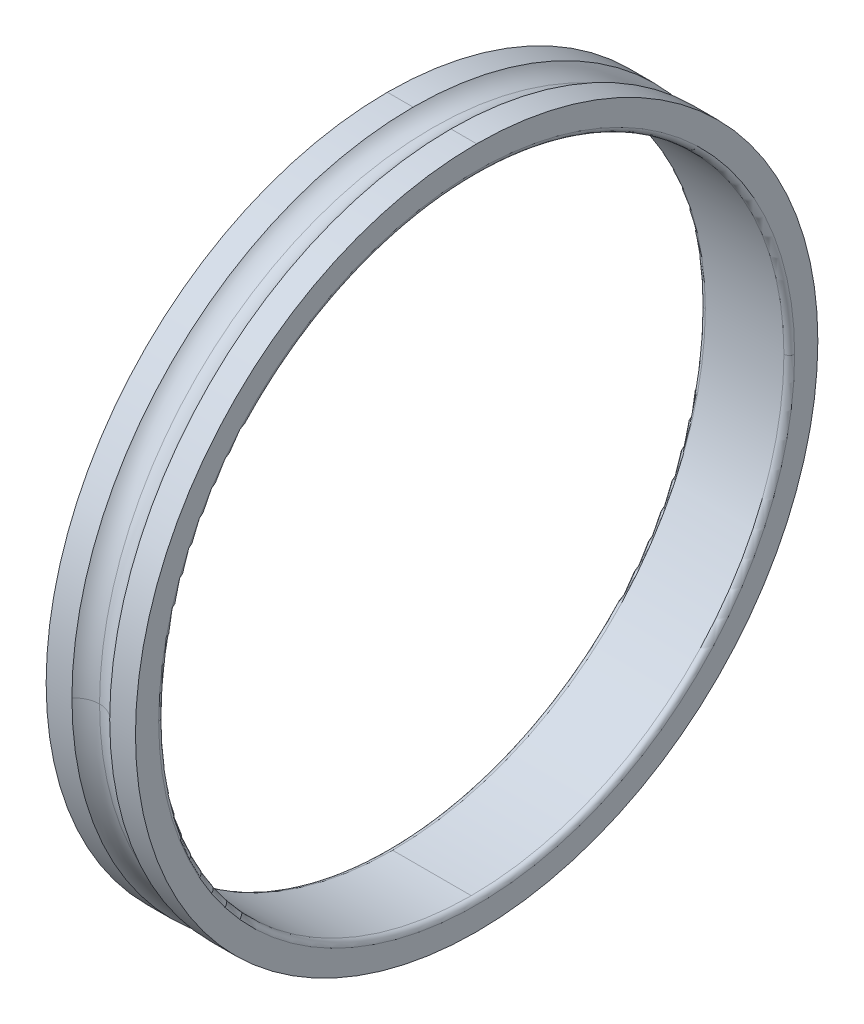
ISO-10303-21;
HEADER;
FILE_DESCRIPTION(('STEP AP214'),'2;1');
FILE_NAME('part.step','',(''),(''),'','','');
FILE_SCHEMA(('AUTOMOTIVE_DESIGN { 1 0 10303 214 1 1 1 1 }'));
ENDSEC;
DATA;
#1=APPLICATION_CONTEXT('core data for automotive mechanical design processes');
#2=APPLICATION_PROTOCOL_DEFINITION('international standard','automotive_design',2000,#1);
#3=PRODUCT_CONTEXT('',#1,'mechanical');
#4=PRODUCT('Part','Part','',(#3));
#5=PRODUCT_RELATED_PRODUCT_CATEGORY('part','',(#4));
#6=PRODUCT_DEFINITION_FORMATION('','',#4);
#7=PRODUCT_DEFINITION_CONTEXT('part definition',#1,'design');
#8=PRODUCT_DEFINITION('design','',#6,#7);
#9=PRODUCT_DEFINITION_SHAPE('','',#8);
#10=(LENGTH_UNIT() NAMED_UNIT(*) SI_UNIT(.MILLI.,.METRE.));
#11=(NAMED_UNIT(*) PLANE_ANGLE_UNIT() SI_UNIT($,.RADIAN.));
#12=(NAMED_UNIT(*) SI_UNIT($,.STERADIAN.) SOLID_ANGLE_UNIT());
#13=UNCERTAINTY_MEASURE_WITH_UNIT(LENGTH_MEASURE(1.E-05),#10,'distance_accuracy_value','');
#14=(GEOMETRIC_REPRESENTATION_CONTEXT(3) GLOBAL_UNCERTAINTY_ASSIGNED_CONTEXT((#13)) GLOBAL_UNIT_ASSIGNED_CONTEXT((#10,
#11,#12)) REPRESENTATION_CONTEXT('',''));
#15=CARTESIAN_POINT('',(0.,0.,0.));
#16=DIRECTION('',(0.,0.,1.));
#17=DIRECTION('',(1.,0.,0.));
#18=AXIS2_PLACEMENT_3D('',#15,#16,#17);
#19=CARTESIAN_POINT('',(8.55797967844375,0.,0.));
#20=DIRECTION('',(1.,0.,0.));
#21=DIRECTION('',(0.,1.,0.));
#22=AXIS2_PLACEMENT_3D('',#19,#20,#21);
#23=CYLINDRICAL_SURFACE('',#22,38.2);
#24=DIRECTION('',(1.,0.,0.));
#25=VECTOR('',#24,1.);
#26=CARTESIAN_POINT('',(8.55797967844375,38.2,0.));
#27=LINE('',#26,#25);
#28=CARTESIAN_POINT('',(7.1159593568875,38.2,0.));
#29=VERTEX_POINT('',#28);
#30=CARTESIAN_POINT('',(10.,38.2,0.));
#31=VERTEX_POINT('',#30);
#32=EDGE_CURVE('E150',#29,#31,#27,.T.);
#33=ORIENTED_EDGE('',*,*,#32,.T.);
#34=CARTESIAN_POINT('',(10.,0.,0.));
#35=DIRECTION('',(1.,0.,0.));
#36=DIRECTION('',(0.,1.,0.));
#37=AXIS2_PLACEMENT_3D('',#34,#35,#36);
#38=CIRCLE('',#37,38.2);
#39=CARTESIAN_POINT('',(10.,-38.2,0.));
#40=VERTEX_POINT('',#39);
#41=EDGE_CURVE('E103',#40,#31,#38,.T.);
#42=ORIENTED_EDGE('',*,*,#41,.F.);
#43=DIRECTION('',(-1.,0.,0.));
#44=VECTOR('',#43,1.);
#45=CARTESIAN_POINT('',(8.55797967844375,-38.2,0.));
#46=LINE('',#45,#44);
#47=CARTESIAN_POINT('',(7.1159593568875,-38.2,0.));
#48=VERTEX_POINT('',#47);
#49=EDGE_CURVE('E156',#40,#48,#46,.T.);
#50=ORIENTED_EDGE('',*,*,#49,.T.);
#51=CARTESIAN_POINT('',(7.1159593568875,0.,0.));
#52=DIRECTION('',(1.,0.,0.));
#53=DIRECTION('',(0.,1.,0.));
#54=AXIS2_PLACEMENT_3D('',#51,#52,#53);
#55=CIRCLE('',#54,38.2);
#56=CARTESIAN_POINT('',(7.1159593568875,0.,-38.2));
#57=VERTEX_POINT('',#56);
#58=EDGE_CURVE('E140',#48,#57,#55,.T.);
#59=ORIENTED_EDGE('',*,*,#58,.T.);
#60=CARTESIAN_POINT('',(7.1159593568875,0.,0.));
#61=DIRECTION('',(1.,0.,0.));
#62=DIRECTION('',(0.,1.,0.));
#63=AXIS2_PLACEMENT_3D('',#60,#61,#62);
#64=CIRCLE('',#63,38.2);
#65=EDGE_CURVE('E147',#57,#29,#64,.T.);
#66=ORIENTED_EDGE('',*,*,#65,.T.);
#67=EDGE_LOOP('',(#33,#42,#50,#59,#66));
#68=FACE_BOUND('',#67,.T.);
#69=ADVANCED_FACE('F16',(#68),#23,.T.);
#70=CARTESIAN_POINT('',(5.,0.,0.));
#71=DIRECTION('',(1.,0.,0.));
#72=DIRECTION('',(0.,0.,-1.));
#73=AXIS2_PLACEMENT_3D('',#70,#71,#72);
#74=TOROIDAL_SURFACE('',#73,40.,2.778);
#75=CARTESIAN_POINT('',(5.,0.,0.));
#76=DIRECTION('',(-1.,0.,0.));
#77=DIRECTION('',(0.,0.,1.));
#78=AXIS2_PLACEMENT_3D('',#75,#76,#77);
#79=CIRCLE('',#78,37.222);
#80=CARTESIAN_POINT('',(5.,0.,37.222));
#81=VERTEX_POINT('',#80);
#82=CARTESIAN_POINT('',(5.,0.,-37.222));
#83=VERTEX_POINT('',#82);
#84=EDGE_CURVE('E234',#81,#83,#79,.T.);
#85=ORIENTED_EDGE('',*,*,#84,.T.);
#86=CARTESIAN_POINT('',(5.,0.,-40.));
#87=DIRECTION('',(0.,-1.,0.));
#88=DIRECTION('',(0.,0.,-1.));
#89=AXIS2_PLACEMENT_3D('',#86,#87,#88);
#90=CIRCLE('',#89,2.778);
#91=CARTESIAN_POINT('',(2.88404064311247,0.,-38.2));
#92=VERTEX_POINT('',#91);
#93=EDGE_CURVE('E174',#83,#92,#90,.T.);
#94=ORIENTED_EDGE('',*,*,#93,.T.);
#95=CARTESIAN_POINT('',(2.88404064311247,0.,0.));
#96=DIRECTION('',(1.,0.,0.));
#97=DIRECTION('',(0.,1.,0.));
#98=AXIS2_PLACEMENT_3D('',#95,#96,#97);
#99=CIRCLE('',#98,38.2);
#100=CARTESIAN_POINT('',(2.88404064311247,38.2,0.));
#101=VERTEX_POINT('',#100);
#102=EDGE_CURVE('E11',#92,#101,#99,.T.);
#103=ORIENTED_EDGE('',*,*,#102,.T.);
#104=CARTESIAN_POINT('',(2.88404064311247,0.,0.));
#105=DIRECTION('',(1.,0.,0.));
#106=DIRECTION('',(0.,1.,0.));
#107=AXIS2_PLACEMENT_3D('',#104,#105,#106);
#108=CIRCLE('',#107,38.2);
#109=CARTESIAN_POINT('',(2.88404064311247,0.,38.2));
#110=VERTEX_POINT('',#109);
#111=EDGE_CURVE('E183',#101,#110,#108,.T.);
#112=ORIENTED_EDGE('',*,*,#111,.T.);
#113=CARTESIAN_POINT('',(5.,0.,40.));
#114=DIRECTION('',(0.,-1.,0.));
#115=DIRECTION('',(0.,0.,1.));
#116=AXIS2_PLACEMENT_3D('',#113,#114,#115);
#117=CIRCLE('',#116,2.778);
#118=EDGE_CURVE('E165',#110,#81,#117,.T.);
#119=ORIENTED_EDGE('',*,*,#118,.T.);
#120=EDGE_LOOP('',(#85,#94,#103,#112,#119));
#121=FACE_BOUND('',#120,.T.);
#122=ADVANCED_FACE('F254',(#121),#74,.F.);
#123=CARTESIAN_POINT('',(1.44202032155623,0.,0.));
#124=DIRECTION('',(1.,0.,0.));
#125=DIRECTION('',(0.,1.,0.));
#126=AXIS2_PLACEMENT_3D('',#123,#124,#125);
#127=CYLINDRICAL_SURFACE('',#126,38.2);
#128=DIRECTION('',(1.,0.,0.));
#129=VECTOR('',#128,1.);
#130=CARTESIAN_POINT('',(1.44202032155623,38.2,0.));
#131=LINE('',#130,#129);
#132=CARTESIAN_POINT('',(0.,38.2,0.));
#133=VERTEX_POINT('',#132);
#134=EDGE_CURVE('E177',#133,#101,#131,.T.);
#135=ORIENTED_EDGE('',*,*,#134,.T.);
#136=ORIENTED_EDGE('',*,*,#102,.F.);
#137=CARTESIAN_POINT('',(2.88404064311247,0.,0.));
#138=DIRECTION('',(1.,0.,0.));
#139=DIRECTION('',(0.,1.,0.));
#140=AXIS2_PLACEMENT_3D('',#137,#138,#139);
#141=CIRCLE('',#140,38.2);
#142=CARTESIAN_POINT('',(2.88404064311247,-38.2,0.));
#143=VERTEX_POINT('',#142);
#144=EDGE_CURVE('E171',#143,#92,#141,.T.);
#145=ORIENTED_EDGE('',*,*,#144,.F.);
#146=DIRECTION('',(-1.,0.,0.));
#147=VECTOR('',#146,1.);
#148=CARTESIAN_POINT('',(1.44202032155623,-38.2,0.));
#149=LINE('',#148,#147);
#150=CARTESIAN_POINT('',(0.,-38.2,0.));
#151=VERTEX_POINT('',#150);
#152=EDGE_CURVE('E181',#143,#151,#149,.T.);
#153=ORIENTED_EDGE('',*,*,#152,.T.);
#154=CARTESIAN_POINT('',(0.,0.,0.));
#155=DIRECTION('',(1.,0.,0.));
#156=DIRECTION('',(0.,1.,0.));
#157=AXIS2_PLACEMENT_3D('',#154,#155,#156);
#158=CIRCLE('',#157,38.2);
#159=EDGE_CURVE('E25',#151,#133,#158,.T.);
#160=ORIENTED_EDGE('',*,*,#159,.T.);
#161=EDGE_LOOP('',(#135,#136,#145,#153,#160));
#162=FACE_BOUND('',#161,.T.);
#163=ADVANCED_FACE('F224',(#162),#127,.T.);
#164=CARTESIAN_POINT('',(0.,36.9,0.));
#165=DIRECTION('',(-1.,0.,0.));
#166=DIRECTION('',(0.,0.,1.));
#167=AXIS2_PLACEMENT_3D('',#164,#165,#166);
#168=PLANE('',#167);
#169=CARTESIAN_POINT('',(0.,0.,0.));
#170=DIRECTION('',(1.,0.,0.));
#171=DIRECTION('',(0.,1.,0.));
#172=AXIS2_PLACEMENT_3D('',#169,#170,#171);
#173=CIRCLE('',#172,35.6);
#174=CARTESIAN_POINT('',(0.,0.,35.6));
#175=VERTEX_POINT('',#174);
#176=CARTESIAN_POINT('',(0.,0.,-35.6));
#177=VERTEX_POINT('',#176);
#178=EDGE_CURVE('E125',#175,#177,#173,.T.);
#179=ORIENTED_EDGE('',*,*,#178,.T.);
#180=CARTESIAN_POINT('',(0.,0.,0.));
#181=DIRECTION('',(1.,0.,0.));
#182=DIRECTION('',(0.,1.,0.));
#183=AXIS2_PLACEMENT_3D('',#180,#181,#182);
#184=CIRCLE('',#183,35.6);
#185=EDGE_CURVE('E197',#177,#175,#184,.T.);
#186=ORIENTED_EDGE('',*,*,#185,.T.);
#187=EDGE_LOOP('',(#179,#186));
#188=FACE_BOUND('',#187,.T.);
#189=CARTESIAN_POINT('',(0.,0.,0.));
#190=DIRECTION('',(1.,0.,0.));
#191=DIRECTION('',(0.,1.,0.));
#192=AXIS2_PLACEMENT_3D('',#189,#190,#191);
#193=CIRCLE('',#192,38.2);
#194=EDGE_CURVE('E178',#133,#151,#193,.T.);
#195=ORIENTED_EDGE('',*,*,#194,.F.);
#196=ORIENTED_EDGE('',*,*,#159,.F.);
#197=EDGE_LOOP('',(#195,#196));
#198=FACE_BOUND('',#197,.T.);
#199=ADVANCED_FACE('F221',(#188,#198),#168,.T.);
#200=CARTESIAN_POINT('',(0.6,0.,0.));
#201=DIRECTION('',(1.,0.,0.));
#202=DIRECTION('',(0.,0.,-1.));
#203=AXIS2_PLACEMENT_3D('',#200,#201,#202);
#204=TOROIDAL_SURFACE('',#203,35.6,0.6);
#205=CARTESIAN_POINT('',(0.6,0.,-35.6));
#206=DIRECTION('',(0.,-1.,0.));
#207=DIRECTION('',(0.,0.,-1.));
#208=AXIS2_PLACEMENT_3D('',#205,#206,#207);
#209=CIRCLE('',#208,0.6);
#210=CARTESIAN_POINT('',(0.6,0.,-35.));
#211=VERTEX_POINT('',#210);
#212=EDGE_CURVE('E185',#211,#177,#209,.T.);
#213=ORIENTED_EDGE('',*,*,#212,.T.);
#214=ORIENTED_EDGE('',*,*,#178,.F.);
#215=CARTESIAN_POINT('',(0.6,0.,35.6));
#216=DIRECTION('',(0.,-1.,0.));
#217=DIRECTION('',(0.,0.,1.));
#218=AXIS2_PLACEMENT_3D('',#215,#216,#217);
#219=CIRCLE('',#218,0.6);
#220=CARTESIAN_POINT('',(0.6,0.,35.));
#221=VERTEX_POINT('',#220);
#222=EDGE_CURVE('E194',#175,#221,#219,.T.);
#223=ORIENTED_EDGE('',*,*,#222,.T.);
#224=CARTESIAN_POINT('',(0.6,0.,0.));
#225=DIRECTION('',(1.,0.,0.));
#226=DIRECTION('',(0.,1.,0.));
#227=AXIS2_PLACEMENT_3D('',#224,#225,#226);
#228=CIRCLE('',#227,35.);
#229=CARTESIAN_POINT('',(0.6,-35.,0.));
#230=VERTEX_POINT('',#229);
#231=EDGE_CURVE('E123',#221,#230,#228,.T.);
#232=ORIENTED_EDGE('',*,*,#231,.T.);
#233=CARTESIAN_POINT('',(0.6,0.,0.));
#234=DIRECTION('',(1.,0.,0.));
#235=DIRECTION('',(0.,1.,0.));
#236=AXIS2_PLACEMENT_3D('',#233,#234,#235);
#237=CIRCLE('',#236,35.);
#238=EDGE_CURVE('E202',#230,#211,#237,.T.);
#239=ORIENTED_EDGE('',*,*,#238,.T.);
#240=EDGE_LOOP('',(#213,#214,#223,#232,#239));
#241=FACE_BOUND('',#240,.T.);
#242=ADVANCED_FACE('F220',(#241),#204,.T.);
#243=CARTESIAN_POINT('',(5.,0.,0.));
#244=DIRECTION('',(1.,0.,0.));
#245=DIRECTION('',(0.,1.,0.));
#246=AXIS2_PLACEMENT_3D('',#243,#244,#245);
#247=CYLINDRICAL_SURFACE('',#246,35.);
#248=DIRECTION('',(1.,0.,0.));
#249=VECTOR('',#248,1.);
#250=CARTESIAN_POINT('',(5.,35.,0.));
#251=LINE('',#250,#249);
#252=CARTESIAN_POINT('',(0.6,35.,0.));
#253=VERTEX_POINT('',#252);
#254=CARTESIAN_POINT('',(9.4,35.,0.));
#255=VERTEX_POINT('',#254);
#256=EDGE_CURVE('E199',#253,#255,#251,.T.);
#257=ORIENTED_EDGE('',*,*,#256,.T.);
#258=CARTESIAN_POINT('',(9.4,0.,0.));
#259=DIRECTION('',(1.,0.,0.));
#260=DIRECTION('',(0.,1.,0.));
#261=AXIS2_PLACEMENT_3D('',#258,#259,#260);
#262=CIRCLE('',#261,35.);
#263=CARTESIAN_POINT('',(9.4,0.,35.));
#264=VERTEX_POINT('',#263);
#265=EDGE_CURVE('E120',#255,#264,#262,.T.);
#266=ORIENTED_EDGE('',*,*,#265,.T.);
#267=CARTESIAN_POINT('',(9.4,0.,0.));
#268=DIRECTION('',(1.,0.,0.));
#269=DIRECTION('',(0.,1.,0.));
#270=AXIS2_PLACEMENT_3D('',#267,#268,#269);
#271=CIRCLE('',#270,35.);
#272=CARTESIAN_POINT('',(9.4,-35.,0.));
#273=VERTEX_POINT('',#272);
#274=EDGE_CURVE('E32',#264,#273,#271,.T.);
#275=ORIENTED_EDGE('',*,*,#274,.T.);
#276=DIRECTION('',(-1.,0.,0.));
#277=VECTOR('',#276,1.);
#278=CARTESIAN_POINT('',(5.,-35.,0.));
#279=LINE('',#278,#277);
#280=EDGE_CURVE('E205',#273,#230,#279,.T.);
#281=ORIENTED_EDGE('',*,*,#280,.T.);
#282=ORIENTED_EDGE('',*,*,#231,.F.);
#283=CARTESIAN_POINT('',(0.6,0.,0.));
#284=DIRECTION('',(1.,0.,0.));
#285=DIRECTION('',(0.,1.,0.));
#286=AXIS2_PLACEMENT_3D('',#283,#284,#285);
#287=CIRCLE('',#286,35.);
#288=EDGE_CURVE('E191',#253,#221,#287,.T.);
#289=ORIENTED_EDGE('',*,*,#288,.F.);
#290=EDGE_LOOP('',(#257,#266,#275,#281,#282,#289));
#291=FACE_BOUND('',#290,.T.);
#292=ADVANCED_FACE('F18',(#291),#247,.F.);
#293=CARTESIAN_POINT('',(9.4,0.,0.));
#294=DIRECTION('',(1.,0.,0.));
#295=DIRECTION('',(0.,0.,-1.));
#296=AXIS2_PLACEMENT_3D('',#293,#294,#295);
#297=TOROIDAL_SURFACE('',#296,35.6,0.6);
#298=CARTESIAN_POINT('',(9.4,0.,-35.6));
#299=DIRECTION('',(0.,-1.,0.));
#300=DIRECTION('',(0.,0.,-1.));
#301=AXIS2_PLACEMENT_3D('',#298,#299,#300);
#302=CIRCLE('',#301,0.6);
#303=CARTESIAN_POINT('',(10.,0.,-35.6));
#304=VERTEX_POINT('',#303);
#305=CARTESIAN_POINT('',(9.4,0.,-35.));
#306=VERTEX_POINT('',#305);
#307=EDGE_CURVE('E97',#304,#306,#302,.T.);
#308=ORIENTED_EDGE('',*,*,#307,.T.);
#309=CARTESIAN_POINT('',(9.4,0.,0.));
#310=DIRECTION('',(1.,0.,0.));
#311=DIRECTION('',(0.,1.,0.));
#312=AXIS2_PLACEMENT_3D('',#309,#310,#311);
#313=CIRCLE('',#312,35.);
#314=EDGE_CURVE('E115',#273,#306,#313,.T.);
#315=ORIENTED_EDGE('',*,*,#314,.F.);
#316=ORIENTED_EDGE('',*,*,#274,.F.);
#317=CARTESIAN_POINT('',(9.4,0.,35.6));
#318=DIRECTION('',(0.,-1.,0.));
#319=DIRECTION('',(0.,0.,1.));
#320=AXIS2_PLACEMENT_3D('',#317,#318,#319);
#321=CIRCLE('',#320,0.6);
#322=CARTESIAN_POINT('',(10.,0.,35.6));
#323=VERTEX_POINT('',#322);
#324=EDGE_CURVE('E100',#264,#323,#321,.T.);
#325=ORIENTED_EDGE('',*,*,#324,.T.);
#326=CARTESIAN_POINT('',(10.,0.,0.));
#327=DIRECTION('',(1.,0.,0.));
#328=DIRECTION('',(0.,1.,0.));
#329=AXIS2_PLACEMENT_3D('',#326,#327,#328);
#330=CIRCLE('',#329,35.6);
#331=EDGE_CURVE('E93',#323,#304,#330,.T.);
#332=ORIENTED_EDGE('',*,*,#331,.T.);
#333=EDGE_LOOP('',(#308,#315,#316,#325,#332));
#334=FACE_BOUND('',#333,.T.);
#335=ADVANCED_FACE('F95',(#334),#297,.T.);
#336=CARTESIAN_POINT('',(10.,36.9,0.));
#337=DIRECTION('',(1.,0.,0.));
#338=DIRECTION('',(0.,1.,0.));
#339=AXIS2_PLACEMENT_3D('',#336,#337,#338);
#340=PLANE('',#339);
#341=CARTESIAN_POINT('',(10.,0.,0.));
#342=DIRECTION('',(1.,0.,0.));
#343=DIRECTION('',(0.,1.,0.));
#344=AXIS2_PLACEMENT_3D('',#341,#342,#343);
#345=CIRCLE('',#344,35.6);
#346=EDGE_CURVE('E105',#304,#323,#345,.T.);
#347=ORIENTED_EDGE('',*,*,#346,.F.);
#348=ORIENTED_EDGE('',*,*,#331,.F.);
#349=EDGE_LOOP('',(#347,#348));
#350=FACE_BOUND('',#349,.T.);
#351=CARTESIAN_POINT('',(10.,0.,0.));
#352=DIRECTION('',(1.,0.,0.));
#353=DIRECTION('',(0.,1.,0.));
#354=AXIS2_PLACEMENT_3D('',#351,#352,#353);
#355=CIRCLE('',#354,38.2);
#356=EDGE_CURVE('E158',#31,#40,#355,.T.);
#357=ORIENTED_EDGE('',*,*,#356,.T.);
#358=ORIENTED_EDGE('',*,*,#41,.T.);
#359=EDGE_LOOP('',(#357,#358));
#360=FACE_BOUND('',#359,.T.);
#361=ADVANCED_FACE('F106',(#350,#360),#340,.T.);
#362=CARTESIAN_POINT('',(9.4,0.,0.));
#363=DIRECTION('',(1.,0.,0.));
#364=DIRECTION('',(0.,0.,-1.));
#365=AXIS2_PLACEMENT_3D('',#362,#363,#364);
#366=TOROIDAL_SURFACE('',#365,35.6,0.6);
#367=ORIENTED_EDGE('',*,*,#307,.F.);
#368=ORIENTED_EDGE('',*,*,#346,.T.);
#369=ORIENTED_EDGE('',*,*,#324,.F.);
#370=ORIENTED_EDGE('',*,*,#265,.F.);
#371=CARTESIAN_POINT('',(9.4,0.,0.));
#372=DIRECTION('',(1.,0.,0.));
#373=DIRECTION('',(0.,1.,0.));
#374=AXIS2_PLACEMENT_3D('',#371,#372,#373);
#375=CIRCLE('',#374,35.);
#376=EDGE_CURVE('E112',#306,#255,#375,.T.);
#377=ORIENTED_EDGE('',*,*,#376,.F.);
#378=EDGE_LOOP('',(#367,#368,#369,#370,#377));
#379=FACE_BOUND('',#378,.T.);
#380=ADVANCED_FACE('F110',(#379),#366,.T.);
#381=CARTESIAN_POINT('',(5.,0.,0.));
#382=DIRECTION('',(1.,0.,0.));
#383=DIRECTION('',(0.,1.,0.));
#384=AXIS2_PLACEMENT_3D('',#381,#382,#383);
#385=CYLINDRICAL_SURFACE('',#384,35.);
#386=ORIENTED_EDGE('',*,*,#256,.F.);
#387=CARTESIAN_POINT('',(0.6,0.,0.));
#388=DIRECTION('',(1.,0.,0.));
#389=DIRECTION('',(0.,1.,0.));
#390=AXIS2_PLACEMENT_3D('',#387,#388,#389);
#391=CIRCLE('',#390,35.);
#392=EDGE_CURVE('E188',#211,#253,#391,.T.);
#393=ORIENTED_EDGE('',*,*,#392,.F.);
#394=ORIENTED_EDGE('',*,*,#238,.F.);
#395=ORIENTED_EDGE('',*,*,#280,.F.);
#396=ORIENTED_EDGE('',*,*,#314,.T.);
#397=ORIENTED_EDGE('',*,*,#376,.T.);
#398=EDGE_LOOP('',(#386,#393,#394,#395,#396,#397));
#399=FACE_BOUND('',#398,.T.);
#400=ADVANCED_FACE('F209',(#399),#385,.F.);
#401=CARTESIAN_POINT('',(0.6,0.,0.));
#402=DIRECTION('',(1.,0.,0.));
#403=DIRECTION('',(0.,0.,-1.));
#404=AXIS2_PLACEMENT_3D('',#401,#402,#403);
#405=TOROIDAL_SURFACE('',#404,35.6,0.6);
#406=ORIENTED_EDGE('',*,*,#212,.F.);
#407=ORIENTED_EDGE('',*,*,#392,.T.);
#408=ORIENTED_EDGE('',*,*,#288,.T.);
#409=ORIENTED_EDGE('',*,*,#222,.F.);
#410=ORIENTED_EDGE('',*,*,#185,.F.);
#411=EDGE_LOOP('',(#406,#407,#408,#409,#410));
#412=FACE_BOUND('',#411,.T.);
#413=ADVANCED_FACE('F217',(#412),#405,.T.);
#414=CARTESIAN_POINT('',(1.44202032155623,0.,0.));
#415=DIRECTION('',(1.,0.,0.));
#416=DIRECTION('',(0.,1.,0.));
#417=AXIS2_PLACEMENT_3D('',#414,#415,#416);
#418=CYLINDRICAL_SURFACE('',#417,38.2);
#419=ORIENTED_EDGE('',*,*,#134,.F.);
#420=ORIENTED_EDGE('',*,*,#194,.T.);
#421=ORIENTED_EDGE('',*,*,#152,.F.);
#422=CARTESIAN_POINT('',(2.88404064311247,0.,0.));
#423=DIRECTION('',(1.,0.,0.));
#424=DIRECTION('',(0.,1.,0.));
#425=AXIS2_PLACEMENT_3D('',#422,#423,#424);
#426=CIRCLE('',#425,38.2);
#427=EDGE_CURVE('E168',#110,#143,#426,.T.);
#428=ORIENTED_EDGE('',*,*,#427,.F.);
#429=ORIENTED_EDGE('',*,*,#111,.F.);
#430=EDGE_LOOP('',(#419,#420,#421,#428,#429));
#431=FACE_BOUND('',#430,.T.);
#432=ADVANCED_FACE('F231',(#431),#418,.T.);
#433=CARTESIAN_POINT('',(5.,0.,0.));
#434=DIRECTION('',(1.,0.,0.));
#435=DIRECTION('',(0.,0.,-1.));
#436=AXIS2_PLACEMENT_3D('',#433,#434,#435);
#437=TOROIDAL_SURFACE('',#436,40.,2.778);
#438=CARTESIAN_POINT('',(5.,0.,0.));
#439=DIRECTION('',(-1.,0.,0.));
#440=DIRECTION('',(0.,0.,1.));
#441=AXIS2_PLACEMENT_3D('',#438,#439,#440);
#442=CIRCLE('',#441,37.222);
#443=EDGE_CURVE('E143',#83,#81,#442,.T.);
#444=ORIENTED_EDGE('',*,*,#443,.T.);
#445=ORIENTED_EDGE('',*,*,#118,.F.);
#446=ORIENTED_EDGE('',*,*,#427,.T.);
#447=ORIENTED_EDGE('',*,*,#144,.T.);
#448=ORIENTED_EDGE('',*,*,#93,.F.);
#449=EDGE_LOOP('',(#444,#445,#446,#447,#448));
#450=FACE_BOUND('',#449,.T.);
#451=ADVANCED_FACE('F257',(#450),#437,.F.);
#452=CARTESIAN_POINT('',(8.55797967844375,0.,0.));
#453=DIRECTION('',(1.,0.,0.));
#454=DIRECTION('',(0.,1.,0.));
#455=AXIS2_PLACEMENT_3D('',#452,#453,#454);
#456=CYLINDRICAL_SURFACE('',#455,38.2);
#457=ORIENTED_EDGE('',*,*,#32,.F.);
#458=CARTESIAN_POINT('',(7.1159593568875,0.,0.));
#459=DIRECTION('',(1.,0.,0.));
#460=DIRECTION('',(0.,1.,0.));
#461=AXIS2_PLACEMENT_3D('',#458,#459,#460);
#462=CIRCLE('',#461,38.2);
#463=CARTESIAN_POINT('',(7.1159593568875,0.,38.2));
#464=VERTEX_POINT('',#463);
#465=EDGE_CURVE('E144',#29,#464,#462,.T.);
#466=ORIENTED_EDGE('',*,*,#465,.T.);
#467=CARTESIAN_POINT('',(7.1159593568875,0.,0.));
#468=DIRECTION('',(1.,0.,0.));
#469=DIRECTION('',(0.,1.,0.));
#470=AXIS2_PLACEMENT_3D('',#467,#468,#469);
#471=CIRCLE('',#470,38.2);
#472=EDGE_CURVE('E142',#464,#48,#471,.T.);
#473=ORIENTED_EDGE('',*,*,#472,.T.);
#474=ORIENTED_EDGE('',*,*,#49,.F.);
#475=ORIENTED_EDGE('',*,*,#356,.F.);
#476=EDGE_LOOP('',(#457,#466,#473,#474,#475));
#477=FACE_BOUND('',#476,.T.);
#478=ADVANCED_FACE('F259',(#477),#456,.T.);
#479=CARTESIAN_POINT('',(5.,0.,0.));
#480=DIRECTION('',(1.,0.,0.));
#481=DIRECTION('',(0.,0.,-1.));
#482=AXIS2_PLACEMENT_3D('',#479,#480,#481);
#483=TOROIDAL_SURFACE('',#482,40.,2.778);
#484=ORIENTED_EDGE('',*,*,#443,.F.);
#485=CARTESIAN_POINT('',(5.,0.,-40.));
#486=DIRECTION('',(0.,-1.,0.));
#487=DIRECTION('',(0.,0.,-1.));
#488=AXIS2_PLACEMENT_3D('',#485,#486,#487);
#489=CIRCLE('',#488,2.778);
#490=EDGE_CURVE('E153',#57,#83,#489,.T.);
#491=ORIENTED_EDGE('',*,*,#490,.F.);
#492=ORIENTED_EDGE('',*,*,#58,.F.);
#493=ORIENTED_EDGE('',*,*,#472,.F.);
#494=CARTESIAN_POINT('',(5.,0.,40.));
#495=DIRECTION('',(0.,-1.,0.));
#496=DIRECTION('',(0.,0.,1.));
#497=AXIS2_PLACEMENT_3D('',#494,#495,#496);
#498=CIRCLE('',#497,2.778);
#499=EDGE_CURVE('E138',#81,#464,#498,.T.);
#500=ORIENTED_EDGE('',*,*,#499,.F.);
#501=EDGE_LOOP('',(#484,#491,#492,#493,#500));
#502=FACE_BOUND('',#501,.T.);
#503=ADVANCED_FACE('F247',(#502),#483,.F.);
#504=CARTESIAN_POINT('',(5.,0.,0.));
#505=DIRECTION('',(1.,0.,0.));
#506=DIRECTION('',(0.,0.,-1.));
#507=AXIS2_PLACEMENT_3D('',#504,#505,#506);
#508=TOROIDAL_SURFACE('',#507,40.,2.778);
#509=ORIENTED_EDGE('',*,*,#84,.F.);
#510=ORIENTED_EDGE('',*,*,#499,.T.);
#511=ORIENTED_EDGE('',*,*,#465,.F.);
#512=ORIENTED_EDGE('',*,*,#65,.F.);
#513=ORIENTED_EDGE('',*,*,#490,.T.);
#514=EDGE_LOOP('',(#509,#510,#511,#512,#513));
#515=FACE_BOUND('',#514,.T.);
#516=ADVANCED_FACE('F242',(#515),#508,.F.);
#517=CLOSED_SHELL('',(#69,#122,#163,#199,#242,#292,#335,#361,#380,#400,#413,#432,#451,#478,#503,#516));
#518=MANIFOLD_SOLID_BREP('B1',#517);
#519=ADVANCED_BREP_SHAPE_REPRESENTATION('',(#18,#518),#14);
#520=SHAPE_DEFINITION_REPRESENTATION(#9,#519);
ENDSEC;
END-ISO-10303-21;
